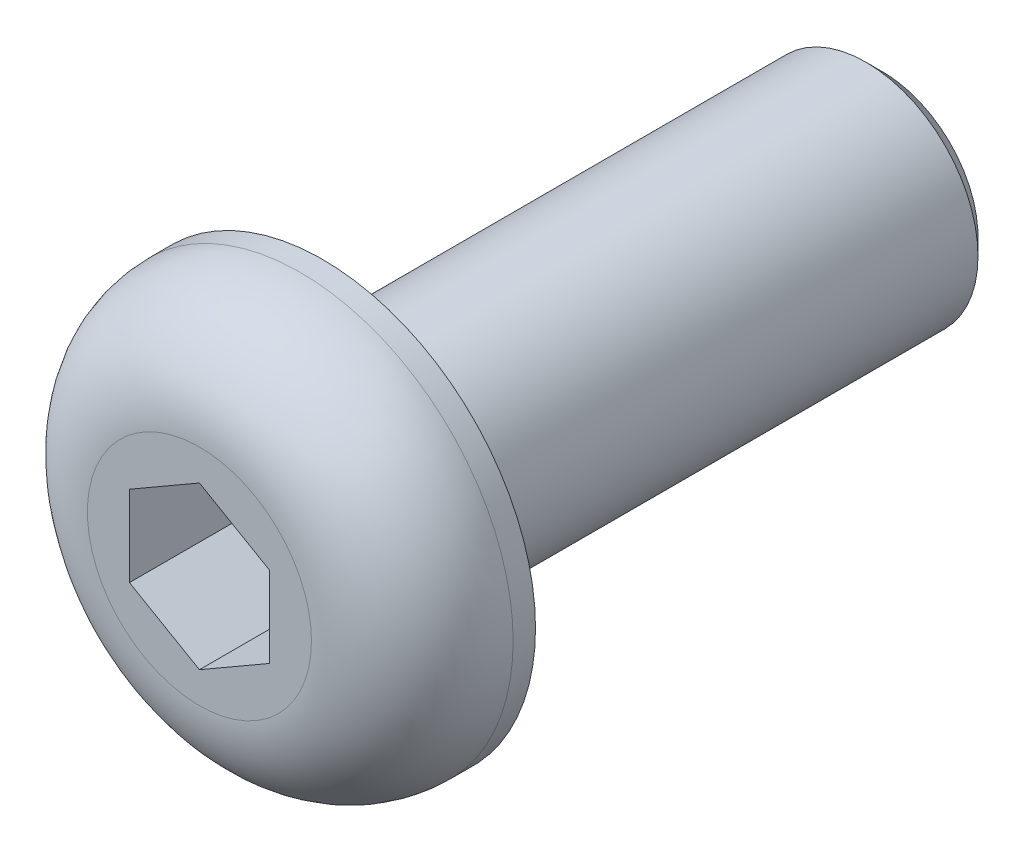
ISO-10303-21;
HEADER;
FILE_DESCRIPTION(('STEP AP214'),'2;1');
FILE_NAME('part.step','',(''),(''),'','','');
FILE_SCHEMA(('AUTOMOTIVE_DESIGN { 1 0 10303 214 1 1 1 1 }'));
ENDSEC;
DATA;
#1=APPLICATION_CONTEXT('core data for automotive mechanical design processes');
#2=APPLICATION_PROTOCOL_DEFINITION('international standard','automotive_design',2000,#1);
#3=PRODUCT_CONTEXT('',#1,'mechanical');
#4=PRODUCT('Part','Part','',(#3));
#5=PRODUCT_RELATED_PRODUCT_CATEGORY('part','',(#4));
#6=PRODUCT_DEFINITION_FORMATION('','',#4);
#7=PRODUCT_DEFINITION_CONTEXT('part definition',#1,'design');
#8=PRODUCT_DEFINITION('design','',#6,#7);
#9=PRODUCT_DEFINITION_SHAPE('','',#8);
#10=(LENGTH_UNIT() NAMED_UNIT(*) SI_UNIT(.MILLI.,.METRE.));
#11=(NAMED_UNIT(*) PLANE_ANGLE_UNIT() SI_UNIT($,.RADIAN.));
#12=(NAMED_UNIT(*) SI_UNIT($,.STERADIAN.) SOLID_ANGLE_UNIT());
#13=UNCERTAINTY_MEASURE_WITH_UNIT(LENGTH_MEASURE(1.E-05),#10,'distance_accuracy_value','');
#14=(GEOMETRIC_REPRESENTATION_CONTEXT(3) GLOBAL_UNCERTAINTY_ASSIGNED_CONTEXT((#13)) GLOBAL_UNIT_ASSIGNED_CONTEXT((#10,
#11,#12)) REPRESENTATION_CONTEXT('',''));
#15=CARTESIAN_POINT('',(0.,0.,0.));
#16=DIRECTION('',(0.,0.,1.));
#17=DIRECTION('',(1.,0.,0.));
#18=AXIS2_PLACEMENT_3D('',#15,#16,#17);
#19=CARTESIAN_POINT('',(0.,0.,0.));
#20=DIRECTION('',(0.,0.,1.));
#21=DIRECTION('',(1.,0.,0.));
#22=AXIS2_PLACEMENT_3D('',#19,#20,#21);
#23=PLANE('',#22);
#24=CARTESIAN_POINT('',(0.,0.,0.));
#25=DIRECTION('',(0.,0.,1.));
#26=DIRECTION('',(1.,0.,0.));
#27=AXIS2_PLACEMENT_3D('',#24,#25,#26);
#28=CIRCLE('',#27,3.8);
#29=CARTESIAN_POINT('',(3.8,0.,0.));
#30=VERTEX_POINT('',#29);
#31=EDGE_CURVE('E136',#30,#30,#28,.T.);
#32=ORIENTED_EDGE('',*,*,#31,.F.);
#33=EDGE_LOOP('',(#32));
#34=FACE_BOUND('',#33,.T.);
#35=CARTESIAN_POINT('',(0.,0.,0.));
#36=DIRECTION('',(0.,0.,1.));
#37=DIRECTION('',(1.,0.,0.));
#38=AXIS2_PLACEMENT_3D('',#35,#36,#37);
#39=CIRCLE('',#38,2.);
#40=CARTESIAN_POINT('',(2.,0.,0.));
#41=VERTEX_POINT('',#40);
#42=EDGE_CURVE('E144',#41,#41,#39,.F.);
#43=ORIENTED_EDGE('',*,*,#42,.F.);
#44=EDGE_LOOP('',(#43));
#45=FACE_BOUND('',#44,.T.);
#46=ADVANCED_FACE('F34',(#34,#45),#23,.F.);
#47=CARTESIAN_POINT('',(0.,0.,2.2));
#48=DIRECTION('',(0.,0.,-1.));
#49=DIRECTION('',(-1.,0.,0.));
#50=AXIS2_PLACEMENT_3D('',#47,#48,#49);
#51=CYLINDRICAL_SURFACE('',#50,3.8);
#52=CARTESIAN_POINT('',(0.,0.,0.4));
#53=DIRECTION('',(0.,0.,1.));
#54=DIRECTION('',(1.,0.,0.));
#55=AXIS2_PLACEMENT_3D('',#52,#53,#54);
#56=CIRCLE('',#55,3.8);
#57=CARTESIAN_POINT('',(3.8,0.,0.4));
#58=VERTEX_POINT('',#57);
#59=EDGE_CURVE('E11',#58,#58,#56,.F.);
#60=ORIENTED_EDGE('',*,*,#59,.T.);
#61=EDGE_LOOP('',(#60));
#62=FACE_BOUND('',#61,.T.);
#63=ORIENTED_EDGE('',*,*,#31,.T.);
#64=EDGE_LOOP('',(#63));
#65=FACE_BOUND('',#64,.T.);
#66=ADVANCED_FACE('F167',(#62,#65),#51,.T.);
#67=CARTESIAN_POINT('',(0.,0.,2.2));
#68=DIRECTION('',(0.,0.,1.));
#69=DIRECTION('',(1.,0.,0.));
#70=AXIS2_PLACEMENT_3D('',#67,#68,#69);
#71=PLANE('',#70);
#72=CARTESIAN_POINT('',(0.,0.,2.2));
#73=DIRECTION('',(0.,0.,1.));
#74=DIRECTION('',(1.,0.,0.));
#75=AXIS2_PLACEMENT_3D('',#72,#73,#74);
#76=CIRCLE('',#75,2.);
#77=CARTESIAN_POINT('',(2.,0.,2.2));
#78=VERTEX_POINT('',#77);
#79=EDGE_CURVE('E42',#78,#78,#76,.T.);
#80=ORIENTED_EDGE('',*,*,#79,.T.);
#81=EDGE_LOOP('',(#80));
#82=FACE_BOUND('',#81,.T.);
#83=DIRECTION('',(-0.866025403784439,0.5,0.));
#84=VECTOR('',#83,1.);
#85=CARTESIAN_POINT('',(1.25,0.721687836487033,2.2));
#86=LINE('',#85,#84);
#87=CARTESIAN_POINT('',(1.25,0.721687836487033,2.2));
#88=VERTEX_POINT('',#87);
#89=CARTESIAN_POINT('',(0.,1.44337567297406,2.2));
#90=VERTEX_POINT('',#89);
#91=EDGE_CURVE('E49',#88,#90,#86,.T.);
#92=ORIENTED_EDGE('',*,*,#91,.F.);
#93=DIRECTION('',(0.,1.,0.));
#94=VECTOR('',#93,1.);
#95=CARTESIAN_POINT('',(1.25,-0.721687836487033,2.2));
#96=LINE('',#95,#94);
#97=CARTESIAN_POINT('',(1.25,-0.721687836487033,2.2));
#98=VERTEX_POINT('',#97);
#99=EDGE_CURVE('E132',#98,#88,#96,.T.);
#100=ORIENTED_EDGE('',*,*,#99,.F.);
#101=DIRECTION('',(0.866025403784439,0.5,0.));
#102=VECTOR('',#101,1.);
#103=CARTESIAN_POINT('',(0.,-1.44337567297406,2.2));
#104=LINE('',#103,#102);
#105=CARTESIAN_POINT('',(0.,-1.44337567297406,2.2));
#106=VERTEX_POINT('',#105);
#107=EDGE_CURVE('E130',#106,#98,#104,.T.);
#108=ORIENTED_EDGE('',*,*,#107,.F.);
#109=DIRECTION('',(0.866025403784439,-0.5,0.));
#110=VECTOR('',#109,1.);
#111=CARTESIAN_POINT('',(-1.25,-0.721687836487032,2.2));
#112=LINE('',#111,#110);
#113=CARTESIAN_POINT('',(-1.25,-0.721687836487032,2.2));
#114=VERTEX_POINT('',#113);
#115=EDGE_CURVE('E97',#114,#106,#112,.T.);
#116=ORIENTED_EDGE('',*,*,#115,.F.);
#117=DIRECTION('',(0.,-1.,0.));
#118=VECTOR('',#117,1.);
#119=CARTESIAN_POINT('',(-1.25,0.721687836487033,2.2));
#120=LINE('',#119,#118);
#121=CARTESIAN_POINT('',(-1.25,0.721687836487033,2.2));
#122=VERTEX_POINT('',#121);
#123=EDGE_CURVE('E126',#122,#114,#120,.T.);
#124=ORIENTED_EDGE('',*,*,#123,.F.);
#125=DIRECTION('',(-0.866025403784439,-0.5,0.));
#126=VECTOR('',#125,1.);
#127=CARTESIAN_POINT('',(0.,1.44337567297406,2.2));
#128=LINE('',#127,#126);
#129=EDGE_CURVE('E123',#90,#122,#128,.T.);
#130=ORIENTED_EDGE('',*,*,#129,.F.);
#131=EDGE_LOOP('',(#92,#100,#108,#116,#124,#130));
#132=FACE_BOUND('',#131,.T.);
#133=ADVANCED_FACE('F155',(#82,#132),#71,.T.);
#134=CARTESIAN_POINT('',(0.,0.,-10.));
#135=DIRECTION('',(0.,0.,1.));
#136=DIRECTION('',(1.,0.,0.));
#137=AXIS2_PLACEMENT_3D('',#134,#135,#136);
#138=CYLINDRICAL_SURFACE('',#137,2.);
#139=CARTESIAN_POINT('',(0.,0.,-9.7));
#140=DIRECTION('',(0.,0.,-1.));
#141=DIRECTION('',(-1.,0.,0.));
#142=AXIS2_PLACEMENT_3D('',#139,#140,#141);
#143=CIRCLE('',#142,2.);
#144=CARTESIAN_POINT('',(-2.,0.,-9.7));
#145=VERTEX_POINT('',#144);
#146=EDGE_CURVE('E150',#145,#145,#143,.F.);
#147=ORIENTED_EDGE('',*,*,#146,.T.);
#148=EDGE_LOOP('',(#147));
#149=FACE_BOUND('',#148,.T.);
#150=ORIENTED_EDGE('',*,*,#42,.T.);
#151=EDGE_LOOP('',(#150));
#152=FACE_BOUND('',#151,.T.);
#153=ADVANCED_FACE('F190',(#149,#152),#138,.T.);
#154=CARTESIAN_POINT('',(0.,0.,-10.));
#155=DIRECTION('',(0.,0.,-1.));
#156=DIRECTION('',(-1.,0.,0.));
#157=AXIS2_PLACEMENT_3D('',#154,#155,#156);
#158=PLANE('',#157);
#159=CARTESIAN_POINT('',(0.,0.,-10.));
#160=DIRECTION('',(0.,0.,-1.));
#161=DIRECTION('',(-1.,0.,0.));
#162=AXIS2_PLACEMENT_3D('',#159,#160,#161);
#163=CIRCLE('',#162,1.7);
#164=CARTESIAN_POINT('',(-1.7,0.,-10.));
#165=VERTEX_POINT('',#164);
#166=EDGE_CURVE('E147',#165,#165,#163,.T.);
#167=ORIENTED_EDGE('',*,*,#166,.T.);
#168=EDGE_LOOP('',(#167));
#169=FACE_BOUND('',#168,.T.);
#170=ADVANCED_FACE('F182',(#169),#158,.T.);
#171=CARTESIAN_POINT('',(0.,0.,-10.));
#172=DIRECTION('',(0.,0.,1.));
#173=DIRECTION('',(1.,0.,0.));
#174=AXIS2_PLACEMENT_3D('',#171,#172,#173);
#175=CONICAL_SURFACE('',#174,1.7,0.785398163397448);
#176=ORIENTED_EDGE('',*,*,#146,.F.);
#177=EDGE_LOOP('',(#176));
#178=FACE_BOUND('',#177,.T.);
#179=ORIENTED_EDGE('',*,*,#166,.F.);
#180=EDGE_LOOP('',(#179));
#181=FACE_BOUND('',#180,.T.);
#182=ADVANCED_FACE('F179',(#178,#181),#175,.T.);
#183=CARTESIAN_POINT('',(1.25,0.721687836487033,0.2));
#184=DIRECTION('',(0.5,0.866025403784439,0.));
#185=DIRECTION('',(-0.866025403784439,0.5,0.));
#186=AXIS2_PLACEMENT_3D('',#183,#184,#185);
#187=PLANE('',#186);
#188=ORIENTED_EDGE('',*,*,#91,.T.);
#189=DIRECTION('',(0.,0.,1.));
#190=VECTOR('',#189,1.);
#191=CARTESIAN_POINT('',(0.,1.44337567297406,0.2));
#192=LINE('',#191,#190);
#193=CARTESIAN_POINT('',(0.,1.44337567297406,0.2));
#194=VERTEX_POINT('',#193);
#195=EDGE_CURVE('E79',#194,#90,#192,.T.);
#196=ORIENTED_EDGE('',*,*,#195,.F.);
#197=DIRECTION('',(-0.866025403784439,0.5,0.));
#198=VECTOR('',#197,1.);
#199=CARTESIAN_POINT('',(1.25,0.721687836487033,0.2));
#200=LINE('',#199,#198);
#201=CARTESIAN_POINT('',(1.25,0.721687836487033,0.2));
#202=VERTEX_POINT('',#201);
#203=EDGE_CURVE('E134',#202,#194,#200,.T.);
#204=ORIENTED_EDGE('',*,*,#203,.F.);
#205=DIRECTION('',(0.,0.,1.));
#206=VECTOR('',#205,1.);
#207=CARTESIAN_POINT('',(1.25,0.721687836487033,0.2));
#208=LINE('',#207,#206);
#209=EDGE_CURVE('E57',#202,#88,#208,.T.);
#210=ORIENTED_EDGE('',*,*,#209,.T.);
#211=EDGE_LOOP('',(#188,#196,#204,#210));
#212=FACE_BOUND('',#211,.T.);
#213=ADVANCED_FACE('F181',(#212),#187,.F.);
#214=CARTESIAN_POINT('',(1.25,-0.721687836487033,0.2));
#215=DIRECTION('',(1.,0.,0.));
#216=DIRECTION('',(0.,1.,0.));
#217=AXIS2_PLACEMENT_3D('',#214,#215,#216);
#218=PLANE('',#217);
#219=ORIENTED_EDGE('',*,*,#99,.T.);
#220=ORIENTED_EDGE('',*,*,#209,.F.);
#221=DIRECTION('',(0.,1.,0.));
#222=VECTOR('',#221,1.);
#223=CARTESIAN_POINT('',(1.25,-0.721687836487033,0.2));
#224=LINE('',#223,#222);
#225=CARTESIAN_POINT('',(1.25,-0.721687836487033,0.2));
#226=VERTEX_POINT('',#225);
#227=EDGE_CURVE('E109',#226,#202,#224,.T.);
#228=ORIENTED_EDGE('',*,*,#227,.F.);
#229=DIRECTION('',(0.,0.,1.));
#230=VECTOR('',#229,1.);
#231=CARTESIAN_POINT('',(1.25,-0.721687836487033,0.2));
#232=LINE('',#231,#230);
#233=EDGE_CURVE('E101',#226,#98,#232,.T.);
#234=ORIENTED_EDGE('',*,*,#233,.T.);
#235=EDGE_LOOP('',(#219,#220,#228,#234));
#236=FACE_BOUND('',#235,.T.);
#237=ADVANCED_FACE('F188',(#236),#218,.F.);
#238=CARTESIAN_POINT('',(0.,-1.44337567297406,0.2));
#239=DIRECTION('',(0.5,-0.866025403784439,0.));
#240=DIRECTION('',(0.866025403784439,0.5,0.));
#241=AXIS2_PLACEMENT_3D('',#238,#239,#240);
#242=PLANE('',#241);
#243=ORIENTED_EDGE('',*,*,#107,.T.);
#244=ORIENTED_EDGE('',*,*,#233,.F.);
#245=DIRECTION('',(0.866025403784439,0.5,0.));
#246=VECTOR('',#245,1.);
#247=CARTESIAN_POINT('',(0.,-1.44337567297406,0.2));
#248=LINE('',#247,#246);
#249=CARTESIAN_POINT('',(0.,-1.44337567297406,0.2));
#250=VERTEX_POINT('',#249);
#251=EDGE_CURVE('E105',#250,#226,#248,.T.);
#252=ORIENTED_EDGE('',*,*,#251,.F.);
#253=DIRECTION('',(0.,0.,1.));
#254=VECTOR('',#253,1.);
#255=CARTESIAN_POINT('',(0.,-1.44337567297406,0.2));
#256=LINE('',#255,#254);
#257=EDGE_CURVE('E90',#250,#106,#256,.T.);
#258=ORIENTED_EDGE('',*,*,#257,.T.);
#259=EDGE_LOOP('',(#243,#244,#252,#258));
#260=FACE_BOUND('',#259,.T.);
#261=ADVANCED_FACE('F106',(#260),#242,.F.);
#262=CARTESIAN_POINT('',(-1.25,-0.721687836487032,0.2));
#263=DIRECTION('',(-0.5,-0.866025403784439,0.));
#264=DIRECTION('',(0.866025403784439,-0.5,0.));
#265=AXIS2_PLACEMENT_3D('',#262,#263,#264);
#266=PLANE('',#265);
#267=ORIENTED_EDGE('',*,*,#115,.T.);
#268=ORIENTED_EDGE('',*,*,#257,.F.);
#269=DIRECTION('',(0.866025403784439,-0.5,0.));
#270=VECTOR('',#269,1.);
#271=CARTESIAN_POINT('',(-1.25,-0.721687836487032,0.2));
#272=LINE('',#271,#270);
#273=CARTESIAN_POINT('',(-1.25,-0.721687836487032,0.2));
#274=VERTEX_POINT('',#273);
#275=EDGE_CURVE('E94',#274,#250,#272,.T.);
#276=ORIENTED_EDGE('',*,*,#275,.F.);
#277=DIRECTION('',(0.,0.,1.));
#278=VECTOR('',#277,1.);
#279=CARTESIAN_POINT('',(-1.25,-0.721687836487032,0.2));
#280=LINE('',#279,#278);
#281=EDGE_CURVE('E102',#274,#114,#280,.T.);
#282=ORIENTED_EDGE('',*,*,#281,.T.);
#283=EDGE_LOOP('',(#267,#268,#276,#282));
#284=FACE_BOUND('',#283,.T.);
#285=ADVANCED_FACE('F92',(#284),#266,.F.);
#286=CARTESIAN_POINT('',(-1.25,0.721687836487033,0.2));
#287=DIRECTION('',(-1.,0.,0.));
#288=DIRECTION('',(0.,0.,1.));
#289=AXIS2_PLACEMENT_3D('',#286,#287,#288);
#290=PLANE('',#289);
#291=ORIENTED_EDGE('',*,*,#123,.T.);
#292=ORIENTED_EDGE('',*,*,#281,.F.);
#293=DIRECTION('',(0.,-1.,0.));
#294=VECTOR('',#293,1.);
#295=CARTESIAN_POINT('',(-1.25,0.721687836487033,0.2));
#296=LINE('',#295,#294);
#297=CARTESIAN_POINT('',(-1.25,0.721687836487033,0.2));
#298=VERTEX_POINT('',#297);
#299=EDGE_CURVE('E115',#298,#274,#296,.T.);
#300=ORIENTED_EDGE('',*,*,#299,.F.);
#301=DIRECTION('',(0.,0.,1.));
#302=VECTOR('',#301,1.);
#303=CARTESIAN_POINT('',(-1.25,0.721687836487033,0.2));
#304=LINE('',#303,#302);
#305=EDGE_CURVE('E139',#298,#122,#304,.T.);
#306=ORIENTED_EDGE('',*,*,#305,.T.);
#307=EDGE_LOOP('',(#291,#292,#300,#306));
#308=FACE_BOUND('',#307,.T.);
#309=ADVANCED_FACE('F206',(#308),#290,.F.);
#310=CARTESIAN_POINT('',(0.,1.44337567297406,0.2));
#311=DIRECTION('',(-0.5,0.866025403784439,0.));
#312=DIRECTION('',(-0.866025403784439,-0.5,0.));
#313=AXIS2_PLACEMENT_3D('',#310,#311,#312);
#314=PLANE('',#313);
#315=ORIENTED_EDGE('',*,*,#129,.T.);
#316=ORIENTED_EDGE('',*,*,#305,.F.);
#317=DIRECTION('',(-0.866025403784439,-0.5,0.));
#318=VECTOR('',#317,1.);
#319=CARTESIAN_POINT('',(0.,1.44337567297406,0.2));
#320=LINE('',#319,#318);
#321=EDGE_CURVE('E117',#194,#298,#320,.T.);
#322=ORIENTED_EDGE('',*,*,#321,.F.);
#323=ORIENTED_EDGE('',*,*,#195,.T.);
#324=EDGE_LOOP('',(#315,#316,#322,#323));
#325=FACE_BOUND('',#324,.T.);
#326=ADVANCED_FACE('F163',(#325),#314,.F.);
#327=CARTESIAN_POINT('',(0.,0.,0.2));
#328=DIRECTION('',(0.,0.,1.));
#329=DIRECTION('',(1.,0.,0.));
#330=AXIS2_PLACEMENT_3D('',#327,#328,#329);
#331=PLANE('',#330);
#332=ORIENTED_EDGE('',*,*,#203,.T.);
#333=ORIENTED_EDGE('',*,*,#321,.T.);
#334=ORIENTED_EDGE('',*,*,#299,.T.);
#335=ORIENTED_EDGE('',*,*,#275,.T.);
#336=ORIENTED_EDGE('',*,*,#251,.T.);
#337=ORIENTED_EDGE('',*,*,#227,.T.);
#338=EDGE_LOOP('',(#332,#333,#334,#335,#336,#337));
#339=FACE_BOUND('',#338,.T.);
#340=ADVANCED_FACE('F112',(#339),#331,.T.);
#341=CARTESIAN_POINT('',(0.,0.,0.4));
#342=DIRECTION('',(0.,0.,1.));
#343=DIRECTION('',(1.,0.,0.));
#344=AXIS2_PLACEMENT_3D('',#341,#342,#343);
#345=TOROIDAL_SURFACE('',#344,2.,1.8);
#346=ORIENTED_EDGE('',*,*,#59,.F.);
#347=EDGE_LOOP('',(#346));
#348=FACE_BOUND('',#347,.T.);
#349=ORIENTED_EDGE('',*,*,#79,.F.);
#350=EDGE_LOOP('',(#349));
#351=FACE_BOUND('',#350,.T.);
#352=ADVANCED_FACE('F36',(#348,#351),#345,.T.);
#353=CLOSED_SHELL('',(#46,#66,#133,#153,#170,#182,#213,#237,#261,#285,#309,#326,#340,#352));
#354=MANIFOLD_SOLID_BREP('B2',#353);
#355=ADVANCED_BREP_SHAPE_REPRESENTATION('',(#18,#354),#14);
#356=SHAPE_DEFINITION_REPRESENTATION(#9,#355);
ENDSEC;
END-ISO-10303-21;
